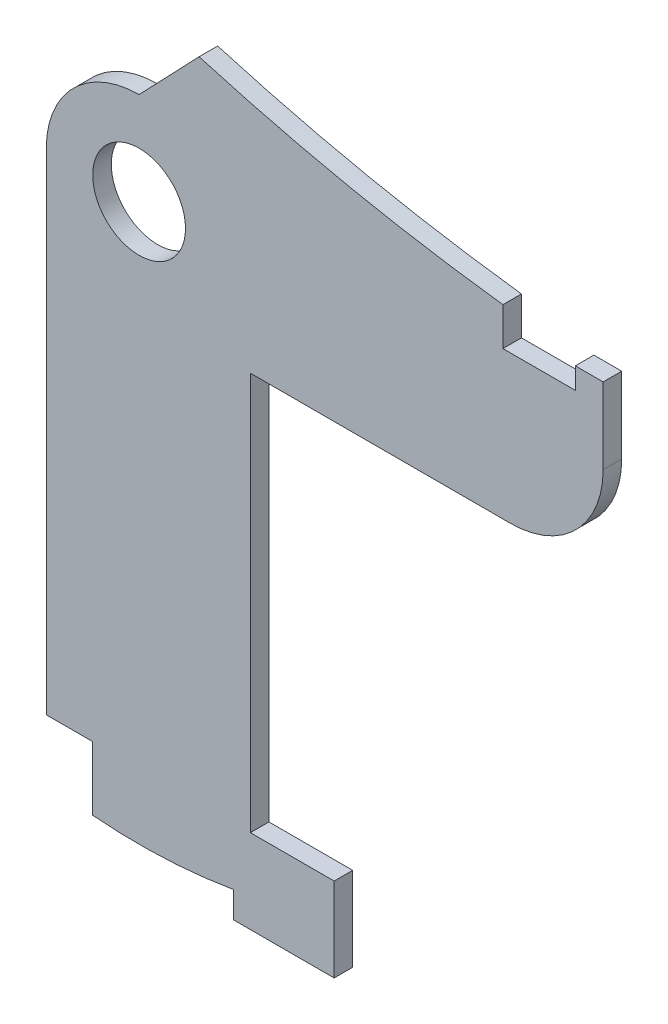
ISO-10303-21;
HEADER;
FILE_DESCRIPTION(('STEP AP214'),'2;1');
FILE_NAME('part.step','',(''),(''),'','','');
FILE_SCHEMA(('AUTOMOTIVE_DESIGN { 1 0 10303 214 1 1 1 1 }'));
ENDSEC;
DATA;
#1=APPLICATION_CONTEXT('core data for automotive mechanical design processes');
#2=APPLICATION_PROTOCOL_DEFINITION('international standard','automotive_design',2000,#1);
#3=PRODUCT_CONTEXT('',#1,'mechanical');
#4=PRODUCT('Part','Part','',(#3));
#5=PRODUCT_RELATED_PRODUCT_CATEGORY('part','',(#4));
#6=PRODUCT_DEFINITION_FORMATION('','',#4);
#7=PRODUCT_DEFINITION_CONTEXT('part definition',#1,'design');
#8=PRODUCT_DEFINITION('design','',#6,#7);
#9=PRODUCT_DEFINITION_SHAPE('','',#8);
#10=(LENGTH_UNIT() NAMED_UNIT(*) SI_UNIT(.MILLI.,.METRE.));
#11=(NAMED_UNIT(*) PLANE_ANGLE_UNIT() SI_UNIT($,.RADIAN.));
#12=(NAMED_UNIT(*) SI_UNIT($,.STERADIAN.) SOLID_ANGLE_UNIT());
#13=UNCERTAINTY_MEASURE_WITH_UNIT(LENGTH_MEASURE(1.E-05),#10,'distance_accuracy_value','');
#14=(GEOMETRIC_REPRESENTATION_CONTEXT(3) GLOBAL_UNCERTAINTY_ASSIGNED_CONTEXT((#13)) GLOBAL_UNIT_ASSIGNED_CONTEXT((#10,
#11,#12)) REPRESENTATION_CONTEXT('',''));
#15=CARTESIAN_POINT('',(0.,0.,0.));
#16=DIRECTION('',(0.,0.,1.));
#17=DIRECTION('',(1.,0.,0.));
#18=AXIS2_PLACEMENT_3D('',#15,#16,#17);
#19=CARTESIAN_POINT('',(37.6551533401373,-13.2873216735918,1.));
#20=DIRECTION('',(0.,0.,-1.));
#21=DIRECTION('',(-1.,0.,0.));
#22=AXIS2_PLACEMENT_3D('',#19,#20,#21);
#23=CYLINDRICAL_SURFACE('',#22,5.);
#24=CARTESIAN_POINT('',(37.6551533401373,-13.2873216735918,0.));
#25=DIRECTION('',(0.,0.,1.));
#26=DIRECTION('',(1.,0.,0.));
#27=AXIS2_PLACEMENT_3D('',#24,#25,#26);
#28=CIRCLE('',#27,5.);
#29=CARTESIAN_POINT('',(42.6551533401373,-13.2873216735918,0.));
#30=VERTEX_POINT('',#29);
#31=CARTESIAN_POINT('',(37.6551533401373,-18.2873216735918,0.));
#32=VERTEX_POINT('',#31);
#33=EDGE_CURVE('E198',#30,#32,#28,.F.);
#34=ORIENTED_EDGE('',*,*,#33,.F.);
#35=DIRECTION('',(0.,0.,-1.));
#36=VECTOR('',#35,1.);
#37=CARTESIAN_POINT('',(42.6551533401373,-13.2873216735918,1.));
#38=LINE('',#37,#36);
#39=CARTESIAN_POINT('',(42.6551533401373,-13.2873216735918,1.));
#40=VERTEX_POINT('',#39);
#41=EDGE_CURVE('E11',#40,#30,#38,.T.);
#42=ORIENTED_EDGE('',*,*,#41,.F.);
#43=CARTESIAN_POINT('',(37.6551533401373,-13.2873216735918,1.));
#44=DIRECTION('',(0.,0.,1.));
#45=DIRECTION('',(1.,0.,0.));
#46=AXIS2_PLACEMENT_3D('',#43,#44,#45);
#47=CIRCLE('',#46,5.);
#48=CARTESIAN_POINT('',(37.6551533401373,-18.2873216735918,1.));
#49=VERTEX_POINT('',#48);
#50=EDGE_CURVE('E250',#40,#49,#47,.F.);
#51=ORIENTED_EDGE('',*,*,#50,.T.);
#52=DIRECTION('',(0.,0.,-1.));
#53=VECTOR('',#52,1.);
#54=CARTESIAN_POINT('',(37.6551533401373,-18.2873216735918,1.));
#55=LINE('',#54,#53);
#56=EDGE_CURVE('E51',#49,#32,#55,.T.);
#57=ORIENTED_EDGE('',*,*,#56,.T.);
#58=EDGE_LOOP('',(#34,#42,#51,#57));
#59=FACE_BOUND('',#58,.T.);
#60=ADVANCED_FACE('F35',(#59),#23,.T.);
#61=CARTESIAN_POINT('',(42.6551533401373,0.,1.));
#62=DIRECTION('',(1.,0.,0.));
#63=DIRECTION('',(0.,0.,-1.));
#64=AXIS2_PLACEMENT_3D('',#61,#62,#63);
#65=PLANE('',#64);
#66=DIRECTION('',(0.,-1.,0.));
#67=VECTOR('',#66,1.);
#68=CARTESIAN_POINT('',(42.6551533401373,0.,0.));
#69=LINE('',#68,#67);
#70=CARTESIAN_POINT('',(42.6551533401373,-9.19140508374461,0.));
#71=VERTEX_POINT('',#70);
#72=EDGE_CURVE('E200',#71,#30,#69,.T.);
#73=ORIENTED_EDGE('',*,*,#72,.F.);
#74=DIRECTION('',(0.,0.,-1.));
#75=VECTOR('',#74,1.);
#76=CARTESIAN_POINT('',(42.6551533401373,-9.19140508374461,1.));
#77=LINE('',#76,#75);
#78=CARTESIAN_POINT('',(42.6551533401373,-9.19140508374461,1.));
#79=VERTEX_POINT('',#78);
#80=EDGE_CURVE('E43',#79,#71,#77,.T.);
#81=ORIENTED_EDGE('',*,*,#80,.F.);
#82=DIRECTION('',(0.,-1.,0.));
#83=VECTOR('',#82,1.);
#84=CARTESIAN_POINT('',(42.6551533401373,0.,1.));
#85=LINE('',#84,#83);
#86=EDGE_CURVE('E305',#79,#40,#85,.T.);
#87=ORIENTED_EDGE('',*,*,#86,.T.);
#88=ORIENTED_EDGE('',*,*,#41,.T.);
#89=EDGE_LOOP('',(#73,#81,#87,#88));
#90=FACE_BOUND('',#89,.T.);
#91=ADVANCED_FACE('F292',(#90),#65,.T.);
#92=CARTESIAN_POINT('',(0.,-9.19140508374461,1.));
#93=DIRECTION('',(0.,1.,0.));
#94=DIRECTION('',(0.,0.,1.));
#95=AXIS2_PLACEMENT_3D('',#92,#93,#94);
#96=PLANE('',#95);
#97=DIRECTION('',(1.,0.,0.));
#98=VECTOR('',#97,1.);
#99=CARTESIAN_POINT('',(0.,-9.19140508374461,0.));
#100=LINE('',#99,#98);
#101=CARTESIAN_POINT('',(41.1551533401373,-9.19140508374461,0.));
#102=VERTEX_POINT('',#101);
#103=EDGE_CURVE('E203',#102,#71,#100,.T.);
#104=ORIENTED_EDGE('',*,*,#103,.F.);
#105=DIRECTION('',(0.,0.,-1.));
#106=VECTOR('',#105,1.);
#107=CARTESIAN_POINT('',(41.1551533401373,-9.19140508374461,1.));
#108=LINE('',#107,#106);
#109=CARTESIAN_POINT('',(41.1551533401373,-9.19140508374461,1.));
#110=VERTEX_POINT('',#109);
#111=EDGE_CURVE('E281',#110,#102,#108,.T.);
#112=ORIENTED_EDGE('',*,*,#111,.F.);
#113=DIRECTION('',(1.,0.,0.));
#114=VECTOR('',#113,1.);
#115=CARTESIAN_POINT('',(0.,-9.19140508374461,1.));
#116=LINE('',#115,#114);
#117=EDGE_CURVE('E288',#110,#79,#116,.T.);
#118=ORIENTED_EDGE('',*,*,#117,.T.);
#119=ORIENTED_EDGE('',*,*,#80,.T.);
#120=EDGE_LOOP('',(#104,#112,#118,#119));
#121=FACE_BOUND('',#120,.T.);
#122=ADVANCED_FACE('F286',(#121),#96,.T.);
#123=CARTESIAN_POINT('',(41.1551533401373,0.,1.));
#124=DIRECTION('',(-1.,0.,0.));
#125=DIRECTION('',(0.,0.,1.));
#126=AXIS2_PLACEMENT_3D('',#123,#124,#125);
#127=PLANE('',#126);
#128=DIRECTION('',(0.,1.,0.));
#129=VECTOR('',#128,1.);
#130=CARTESIAN_POINT('',(41.1551533401373,0.,0.));
#131=LINE('',#130,#129);
#132=CARTESIAN_POINT('',(41.1551533401373,-10.3365932084194,0.));
#133=VERTEX_POINT('',#132);
#134=EDGE_CURVE('E206',#133,#102,#131,.T.);
#135=ORIENTED_EDGE('',*,*,#134,.F.);
#136=DIRECTION('',(0.,0.,-1.));
#137=VECTOR('',#136,1.);
#138=CARTESIAN_POINT('',(41.1551533401373,-10.3365932084194,1.));
#139=LINE('',#138,#137);
#140=CARTESIAN_POINT('',(41.1551533401373,-10.3365932084194,1.));
#141=VERTEX_POINT('',#140);
#142=EDGE_CURVE('E279',#141,#133,#139,.T.);
#143=ORIENTED_EDGE('',*,*,#142,.F.);
#144=DIRECTION('',(0.,1.,0.));
#145=VECTOR('',#144,1.);
#146=CARTESIAN_POINT('',(41.1551533401373,0.,1.));
#147=LINE('',#146,#145);
#148=EDGE_CURVE('E302',#141,#110,#147,.T.);
#149=ORIENTED_EDGE('',*,*,#148,.T.);
#150=ORIENTED_EDGE('',*,*,#111,.T.);
#151=EDGE_LOOP('',(#135,#143,#149,#150));
#152=FACE_BOUND('',#151,.T.);
#153=ADVANCED_FACE('F299',(#152),#127,.T.);
#154=CARTESIAN_POINT('',(0.,-10.3365932084194,1.));
#155=DIRECTION('',(0.,1.,0.));
#156=DIRECTION('',(0.,0.,1.));
#157=AXIS2_PLACEMENT_3D('',#154,#155,#156);
#158=PLANE('',#157);
#159=DIRECTION('',(1.,0.,0.));
#160=VECTOR('',#159,1.);
#161=CARTESIAN_POINT('',(0.,-10.3365932084194,0.));
#162=LINE('',#161,#160);
#163=CARTESIAN_POINT('',(37.2551533401373,-10.3365932084194,0.));
#164=VERTEX_POINT('',#163);
#165=EDGE_CURVE('E209',#164,#133,#162,.T.);
#166=ORIENTED_EDGE('',*,*,#165,.F.);
#167=DIRECTION('',(0.,0.,-1.));
#168=VECTOR('',#167,1.);
#169=CARTESIAN_POINT('',(37.2551533401373,-10.3365932084194,1.));
#170=LINE('',#169,#168);
#171=CARTESIAN_POINT('',(37.2551533401373,-10.3365932084194,1.));
#172=VERTEX_POINT('',#171);
#173=EDGE_CURVE('E277',#172,#164,#170,.T.);
#174=ORIENTED_EDGE('',*,*,#173,.F.);
#175=DIRECTION('',(1.,0.,0.));
#176=VECTOR('',#175,1.);
#177=CARTESIAN_POINT('',(0.,-10.3365932084194,1.));
#178=LINE('',#177,#176);
#179=EDGE_CURVE('E307',#172,#141,#178,.T.);
#180=ORIENTED_EDGE('',*,*,#179,.T.);
#181=ORIENTED_EDGE('',*,*,#142,.T.);
#182=EDGE_LOOP('',(#166,#174,#180,#181));
#183=FACE_BOUND('',#182,.T.);
#184=ADVANCED_FACE('F369',(#183),#158,.T.);
#185=CARTESIAN_POINT('',(37.2551533401373,0.,1.));
#186=DIRECTION('',(1.,0.,0.));
#187=DIRECTION('',(0.,0.,-1.));
#188=AXIS2_PLACEMENT_3D('',#185,#186,#187);
#189=PLANE('',#188);
#190=DIRECTION('',(0.,-1.,0.));
#191=VECTOR('',#190,1.);
#192=CARTESIAN_POINT('',(37.2551533401373,0.,0.));
#193=LINE('',#192,#191);
#194=CARTESIAN_POINT('',(37.2551533401373,-8.2873216735918,0.));
#195=VERTEX_POINT('',#194);
#196=EDGE_CURVE('E212',#195,#164,#193,.T.);
#197=ORIENTED_EDGE('',*,*,#196,.F.);
#198=DIRECTION('',(0.,0.,-1.));
#199=VECTOR('',#198,1.);
#200=CARTESIAN_POINT('',(37.2551533401373,-8.2873216735918,1.));
#201=LINE('',#200,#199);
#202=CARTESIAN_POINT('',(37.2551533401373,-8.2873216735918,1.));
#203=VERTEX_POINT('',#202);
#204=EDGE_CURVE('E275',#203,#195,#201,.T.);
#205=ORIENTED_EDGE('',*,*,#204,.F.);
#206=DIRECTION('',(0.,-1.,0.));
#207=VECTOR('',#206,1.);
#208=CARTESIAN_POINT('',(37.2551533401373,0.,1.));
#209=LINE('',#208,#207);
#210=EDGE_CURVE('E313',#203,#172,#209,.T.);
#211=ORIENTED_EDGE('',*,*,#210,.T.);
#212=ORIENTED_EDGE('',*,*,#173,.T.);
#213=EDGE_LOOP('',(#197,#205,#211,#212));
#214=FACE_BOUND('',#213,.T.);
#215=ADVANCED_FACE('F372',(#214),#189,.T.);
#216=CARTESIAN_POINT('',(49.9016252193587,94.1810195769606,1.));
#217=DIRECTION('',(0.,0.,-1.));
#218=DIRECTION('',(-1.,0.,0.));
#219=AXIS2_PLACEMENT_3D('',#216,#217,#218);
#220=CYLINDRICAL_SURFACE('',#219,103.245795118405);
#221=CARTESIAN_POINT('',(49.9016252193587,94.1810195769606,0.));
#222=DIRECTION('',(0.,0.,1.));
#223=DIRECTION('',(1.,0.,0.));
#224=AXIS2_PLACEMENT_3D('',#221,#222,#223);
#225=CIRCLE('',#224,103.245795118405);
#226=CARTESIAN_POINT('',(20.8870655256356,-4.90404254347698,0.));
#227=VERTEX_POINT('',#226);
#228=EDGE_CURVE('E215',#195,#227,#225,.F.);
#229=ORIENTED_EDGE('',*,*,#228,.T.);
#230=DIRECTION('',(0.,0.,-1.));
#231=VECTOR('',#230,1.);
#232=CARTESIAN_POINT('',(20.8870655256356,-4.90404254347698,1.));
#233=LINE('',#232,#231);
#234=CARTESIAN_POINT('',(20.8870655256356,-4.90404254347698,1.));
#235=VERTEX_POINT('',#234);
#236=EDGE_CURVE('E273',#235,#227,#233,.T.);
#237=ORIENTED_EDGE('',*,*,#236,.F.);
#238=CARTESIAN_POINT('',(49.9016252193587,94.1810195769606,1.));
#239=DIRECTION('',(0.,0.,1.));
#240=DIRECTION('',(1.,0.,0.));
#241=AXIS2_PLACEMENT_3D('',#238,#239,#240);
#242=CIRCLE('',#241,103.245795118405);
#243=EDGE_CURVE('E316',#203,#235,#242,.F.);
#244=ORIENTED_EDGE('',*,*,#243,.F.);
#245=ORIENTED_EDGE('',*,*,#204,.T.);
#246=EDGE_LOOP('',(#229,#237,#244,#245));
#247=FACE_BOUND('',#246,.T.);
#248=ADVANCED_FACE('F376',(#247),#220,.F.);
#249=CARTESIAN_POINT('',(13.3706696032515,-12.772469653591,1.));
#250=DIRECTION('',(-0.723097327047915,0.690746158596746,0.));
#251=DIRECTION('',(-0.690746158596746,-0.723097327047915,0.));
#252=AXIS2_PLACEMENT_3D('',#249,#250,#251);
#253=PLANE('',#252);
#254=DIRECTION('',(0.690746158596746,0.723097327047915,0.));
#255=VECTOR('',#254,1.);
#256=CARTESIAN_POINT('',(13.3706696032515,-12.772469653591,0.));
#257=LINE('',#256,#255);
#258=CARTESIAN_POINT('',(17.6551533401373,-8.2873216735918,0.));
#259=VERTEX_POINT('',#258);
#260=EDGE_CURVE('E218',#259,#227,#257,.T.);
#261=ORIENTED_EDGE('',*,*,#260,.F.);
#262=DIRECTION('',(0.,0.,-1.));
#263=VECTOR('',#262,1.);
#264=CARTESIAN_POINT('',(17.6551533401373,-8.2873216735918,1.));
#265=LINE('',#264,#263);
#266=CARTESIAN_POINT('',(17.6551533401373,-8.2873216735918,1.));
#267=VERTEX_POINT('',#266);
#268=EDGE_CURVE('E271',#267,#259,#265,.T.);
#269=ORIENTED_EDGE('',*,*,#268,.F.);
#270=DIRECTION('',(0.690746158596746,0.723097327047915,0.));
#271=VECTOR('',#270,1.);
#272=CARTESIAN_POINT('',(13.3706696032515,-12.772469653591,1.));
#273=LINE('',#272,#271);
#274=EDGE_CURVE('E318',#267,#235,#273,.T.);
#275=ORIENTED_EDGE('',*,*,#274,.T.);
#276=ORIENTED_EDGE('',*,*,#236,.T.);
#277=EDGE_LOOP('',(#261,#269,#275,#276));
#278=FACE_BOUND('',#277,.T.);
#279=ADVANCED_FACE('F380',(#278),#253,.T.);
#280=CARTESIAN_POINT('',(17.6551533401373,-13.2873216735918,1.));
#281=DIRECTION('',(0.,0.,-1.));
#282=DIRECTION('',(-1.,0.,0.));
#283=AXIS2_PLACEMENT_3D('',#280,#281,#282);
#284=CYLINDRICAL_SURFACE('',#283,5.);
#285=CARTESIAN_POINT('',(17.6551533401373,-13.2873216735918,0.));
#286=DIRECTION('',(0.,0.,1.));
#287=DIRECTION('',(1.,0.,0.));
#288=AXIS2_PLACEMENT_3D('',#285,#286,#287);
#289=CIRCLE('',#288,5.);
#290=CARTESIAN_POINT('',(12.6551533401373,-13.2873216735918,0.));
#291=VERTEX_POINT('',#290);
#292=EDGE_CURVE('E221',#259,#291,#289,.T.);
#293=ORIENTED_EDGE('',*,*,#292,.T.);
#294=DIRECTION('',(0.,0.,-1.));
#295=VECTOR('',#294,1.);
#296=CARTESIAN_POINT('',(12.6551533401373,-13.2873216735918,1.));
#297=LINE('',#296,#295);
#298=CARTESIAN_POINT('',(12.6551533401373,-13.2873216735918,1.));
#299=VERTEX_POINT('',#298);
#300=EDGE_CURVE('E269',#299,#291,#297,.T.);
#301=ORIENTED_EDGE('',*,*,#300,.F.);
#302=CARTESIAN_POINT('',(17.6551533401373,-13.2873216735918,1.));
#303=DIRECTION('',(0.,0.,1.));
#304=DIRECTION('',(1.,0.,0.));
#305=AXIS2_PLACEMENT_3D('',#302,#303,#304);
#306=CIRCLE('',#305,5.);
#307=EDGE_CURVE('E321',#267,#299,#306,.T.);
#308=ORIENTED_EDGE('',*,*,#307,.F.);
#309=ORIENTED_EDGE('',*,*,#268,.T.);
#310=EDGE_LOOP('',(#293,#301,#308,#309));
#311=FACE_BOUND('',#310,.T.);
#312=ADVANCED_FACE('F384',(#311),#284,.T.);
#313=CARTESIAN_POINT('',(12.6551533401373,0.,1.));
#314=DIRECTION('',(-1.,0.,0.));
#315=DIRECTION('',(0.,-1.,0.));
#316=AXIS2_PLACEMENT_3D('',#313,#314,#315);
#317=PLANE('',#316);
#318=DIRECTION('',(0.,1.,0.));
#319=VECTOR('',#318,1.);
#320=CARTESIAN_POINT('',(12.6551533401373,0.,0.));
#321=LINE('',#320,#319);
#322=CARTESIAN_POINT('',(12.6551533401373,-39.7249994987501,0.));
#323=VERTEX_POINT('',#322);
#324=EDGE_CURVE('E224',#323,#291,#321,.T.);
#325=ORIENTED_EDGE('',*,*,#324,.F.);
#326=DIRECTION('',(0.,0.,-1.));
#327=VECTOR('',#326,1.);
#328=CARTESIAN_POINT('',(12.6551533401373,-39.7249994987501,1.));
#329=LINE('',#328,#327);
#330=CARTESIAN_POINT('',(12.6551533401373,-39.7249994987501,1.));
#331=VERTEX_POINT('',#330);
#332=EDGE_CURVE('E267',#331,#323,#329,.T.);
#333=ORIENTED_EDGE('',*,*,#332,.F.);
#334=DIRECTION('',(0.,1.,0.));
#335=VECTOR('',#334,1.);
#336=CARTESIAN_POINT('',(12.6551533401373,0.,1.));
#337=LINE('',#336,#335);
#338=EDGE_CURVE('E323',#331,#299,#337,.T.);
#339=ORIENTED_EDGE('',*,*,#338,.T.);
#340=ORIENTED_EDGE('',*,*,#300,.T.);
#341=EDGE_LOOP('',(#325,#333,#339,#340));
#342=FACE_BOUND('',#341,.T.);
#343=ADVANCED_FACE('F388',(#342),#317,.T.);
#344=CARTESIAN_POINT('',(0.,-39.7249994987501,1.));
#345=DIRECTION('',(0.,-1.,0.));
#346=DIRECTION('',(0.,0.,-1.));
#347=AXIS2_PLACEMENT_3D('',#344,#345,#346);
#348=PLANE('',#347);
#349=DIRECTION('',(-1.,0.,0.));
#350=VECTOR('',#349,1.);
#351=CARTESIAN_POINT('',(0.,-39.7249994987501,0.));
#352=LINE('',#351,#350);
#353=CARTESIAN_POINT('',(15.1551533401373,-39.7249994987501,0.));
#354=VERTEX_POINT('',#353);
#355=EDGE_CURVE('E227',#354,#323,#352,.T.);
#356=ORIENTED_EDGE('',*,*,#355,.F.);
#357=DIRECTION('',(0.,0.,-1.));
#358=VECTOR('',#357,1.);
#359=CARTESIAN_POINT('',(15.1551533401373,-39.7249994987501,1.));
#360=LINE('',#359,#358);
#361=CARTESIAN_POINT('',(15.1551533401373,-39.7249994987501,1.));
#362=VERTEX_POINT('',#361);
#363=EDGE_CURVE('E265',#362,#354,#360,.T.);
#364=ORIENTED_EDGE('',*,*,#363,.F.);
#365=DIRECTION('',(-1.,0.,0.));
#366=VECTOR('',#365,1.);
#367=CARTESIAN_POINT('',(0.,-39.7249994987501,1.));
#368=LINE('',#367,#366);
#369=EDGE_CURVE('E326',#362,#331,#368,.T.);
#370=ORIENTED_EDGE('',*,*,#369,.T.);
#371=ORIENTED_EDGE('',*,*,#332,.T.);
#372=EDGE_LOOP('',(#356,#364,#370,#371));
#373=FACE_BOUND('',#372,.T.);
#374=ADVANCED_FACE('F392',(#373),#348,.T.);
#375=CARTESIAN_POINT('',(15.1551533401373,0.,1.));
#376=DIRECTION('',(-1.,0.,0.));
#377=DIRECTION('',(0.,0.,1.));
#378=AXIS2_PLACEMENT_3D('',#375,#376,#377);
#379=PLANE('',#378);
#380=DIRECTION('',(0.,1.,0.));
#381=VECTOR('',#380,1.);
#382=CARTESIAN_POINT('',(15.1551533401373,0.,0.));
#383=LINE('',#382,#381);
#384=CARTESIAN_POINT('',(15.1551533401373,-43.1617960065011,0.));
#385=VERTEX_POINT('',#384);
#386=EDGE_CURVE('E230',#385,#354,#383,.T.);
#387=ORIENTED_EDGE('',*,*,#386,.F.);
#388=DIRECTION('',(0.,0.,-1.));
#389=VECTOR('',#388,1.);
#390=CARTESIAN_POINT('',(15.1551533401373,-43.1617960065011,1.));
#391=LINE('',#390,#389);
#392=CARTESIAN_POINT('',(15.1551533401373,-43.1617960065011,1.));
#393=VERTEX_POINT('',#392);
#394=EDGE_CURVE('E263',#393,#385,#391,.T.);
#395=ORIENTED_EDGE('',*,*,#394,.F.);
#396=DIRECTION('',(0.,1.,0.));
#397=VECTOR('',#396,1.);
#398=CARTESIAN_POINT('',(15.1551533401373,0.,1.));
#399=LINE('',#398,#397);
#400=EDGE_CURVE('E329',#393,#362,#399,.T.);
#401=ORIENTED_EDGE('',*,*,#400,.T.);
#402=ORIENTED_EDGE('',*,*,#363,.T.);
#403=EDGE_LOOP('',(#387,#395,#401,#402));
#404=FACE_BOUND('',#403,.T.);
#405=ADVANCED_FACE('F396',(#404),#379,.T.);
#406=CARTESIAN_POINT('',(17.6551533401373,-13.2873216735918,1.));
#407=DIRECTION('',(0.,0.,-1.));
#408=DIRECTION('',(-1.,0.,0.));
#409=AXIS2_PLACEMENT_3D('',#406,#407,#408);
#410=CYLINDRICAL_SURFACE('',#409,29.9788961882798);
#411=CARTESIAN_POINT('',(17.6551533401373,-13.2873216735918,0.));
#412=DIRECTION('',(0.,0.,1.));
#413=DIRECTION('',(1.,0.,0.));
#414=AXIS2_PLACEMENT_3D('',#411,#412,#413);
#415=CIRCLE('',#414,29.9788961882798);
#416=CARTESIAN_POINT('',(22.731294665656,-42.8333367333425,0.));
#417=VERTEX_POINT('',#416);
#418=EDGE_CURVE('E233',#385,#417,#415,.T.);
#419=ORIENTED_EDGE('',*,*,#418,.T.);
#420=DIRECTION('',(0.,0.,-1.));
#421=VECTOR('',#420,1.);
#422=CARTESIAN_POINT('',(22.731294665656,-42.8333367333425,1.));
#423=LINE('',#422,#421);
#424=CARTESIAN_POINT('',(22.731294665656,-42.8333367333425,1.));
#425=VERTEX_POINT('',#424);
#426=EDGE_CURVE('E260',#425,#417,#423,.T.);
#427=ORIENTED_EDGE('',*,*,#426,.F.);
#428=CARTESIAN_POINT('',(17.6551533401373,-13.2873216735918,1.));
#429=DIRECTION('',(0.,0.,1.));
#430=DIRECTION('',(1.,0.,0.));
#431=AXIS2_PLACEMENT_3D('',#428,#429,#430);
#432=CIRCLE('',#431,29.9788961882798);
#433=EDGE_CURVE('E332',#393,#425,#432,.T.);
#434=ORIENTED_EDGE('',*,*,#433,.F.);
#435=ORIENTED_EDGE('',*,*,#394,.T.);
#436=EDGE_LOOP('',(#419,#427,#434,#435));
#437=FACE_BOUND('',#436,.T.);
#438=ADVANCED_FACE('F400',(#437),#410,.T.);
#439=CARTESIAN_POINT('',(22.731294665656,0.,1.));
#440=DIRECTION('',(1.,0.,0.));
#441=DIRECTION('',(0.,0.,-1.));
#442=AXIS2_PLACEMENT_3D('',#439,#440,#441);
#443=PLANE('',#442);
#444=DIRECTION('',(0.,-1.,0.));
#445=VECTOR('',#444,1.);
#446=CARTESIAN_POINT('',(22.731294665656,0.,0.));
#447=LINE('',#446,#445);
#448=CARTESIAN_POINT('',(22.731294665656,-44.2490790535218,0.));
#449=VERTEX_POINT('',#448);
#450=EDGE_CURVE('E235',#417,#449,#447,.T.);
#451=ORIENTED_EDGE('',*,*,#450,.T.);
#452=DIRECTION('',(0.,0.,-1.));
#453=VECTOR('',#452,1.);
#454=CARTESIAN_POINT('',(22.731294665656,-44.2490790535218,1.));
#455=LINE('',#454,#453);
#456=CARTESIAN_POINT('',(22.731294665656,-44.2490790535218,1.));
#457=VERTEX_POINT('',#456);
#458=EDGE_CURVE('E257',#457,#449,#455,.T.);
#459=ORIENTED_EDGE('',*,*,#458,.F.);
#460=DIRECTION('',(0.,-1.,0.));
#461=VECTOR('',#460,1.);
#462=CARTESIAN_POINT('',(22.731294665656,0.,1.));
#463=LINE('',#462,#461);
#464=EDGE_CURVE('E334',#425,#457,#463,.T.);
#465=ORIENTED_EDGE('',*,*,#464,.F.);
#466=ORIENTED_EDGE('',*,*,#426,.T.);
#467=EDGE_LOOP('',(#451,#459,#465,#466));
#468=FACE_BOUND('',#467,.T.);
#469=ADVANCED_FACE('F404',(#468),#443,.F.);
#470=CARTESIAN_POINT('',(0.,-44.2490790535218,1.));
#471=DIRECTION('',(0.,1.,0.));
#472=DIRECTION('',(0.,0.,1.));
#473=AXIS2_PLACEMENT_3D('',#470,#471,#472);
#474=PLANE('',#473);
#475=DIRECTION('',(1.,0.,0.));
#476=VECTOR('',#475,1.);
#477=CARTESIAN_POINT('',(0.,-44.2490790535218,0.));
#478=LINE('',#477,#476);
#479=CARTESIAN_POINT('',(28.1634057429237,-44.2490790535218,0.));
#480=VERTEX_POINT('',#479);
#481=EDGE_CURVE('E237',#449,#480,#478,.T.);
#482=ORIENTED_EDGE('',*,*,#481,.T.);
#483=DIRECTION('',(0.,0.,-1.));
#484=VECTOR('',#483,1.);
#485=CARTESIAN_POINT('',(28.1634057429237,-44.2490790535218,1.));
#486=LINE('',#485,#484);
#487=CARTESIAN_POINT('',(28.1634057429237,-44.2490790535218,1.));
#488=VERTEX_POINT('',#487);
#489=EDGE_CURVE('E254',#488,#480,#486,.T.);
#490=ORIENTED_EDGE('',*,*,#489,.F.);
#491=DIRECTION('',(1.,0.,0.));
#492=VECTOR('',#491,1.);
#493=CARTESIAN_POINT('',(0.,-44.2490790535218,1.));
#494=LINE('',#493,#492);
#495=EDGE_CURVE('E336',#457,#488,#494,.T.);
#496=ORIENTED_EDGE('',*,*,#495,.F.);
#497=ORIENTED_EDGE('',*,*,#458,.T.);
#498=EDGE_LOOP('',(#482,#490,#496,#497));
#499=FACE_BOUND('',#498,.T.);
#500=ADVANCED_FACE('F342',(#499),#474,.F.);
#501=CARTESIAN_POINT('',(28.1634057429237,0.,1.));
#502=DIRECTION('',(-1.,0.,0.));
#503=DIRECTION('',(0.,0.,1.));
#504=AXIS2_PLACEMENT_3D('',#501,#502,#503);
#505=PLANE('',#504);
#506=DIRECTION('',(0.,1.,0.));
#507=VECTOR('',#506,1.);
#508=CARTESIAN_POINT('',(28.1634057429237,0.,0.));
#509=LINE('',#508,#507);
#510=CARTESIAN_POINT('',(28.1634057429237,-39.7249994987501,0.));
#511=VERTEX_POINT('',#510);
#512=EDGE_CURVE('E239',#480,#511,#509,.T.);
#513=ORIENTED_EDGE('',*,*,#512,.T.);
#514=DIRECTION('',(0.,0.,-1.));
#515=VECTOR('',#514,1.);
#516=CARTESIAN_POINT('',(28.1634057429237,-39.7249994987501,1.));
#517=LINE('',#516,#515);
#518=CARTESIAN_POINT('',(28.1634057429237,-39.7249994987501,1.));
#519=VERTEX_POINT('',#518);
#520=EDGE_CURVE('E187',#519,#511,#517,.T.);
#521=ORIENTED_EDGE('',*,*,#520,.F.);
#522=DIRECTION('',(0.,1.,0.));
#523=VECTOR('',#522,1.);
#524=CARTESIAN_POINT('',(28.1634057429237,0.,1.));
#525=LINE('',#524,#523);
#526=EDGE_CURVE('E175',#488,#519,#525,.T.);
#527=ORIENTED_EDGE('',*,*,#526,.F.);
#528=ORIENTED_EDGE('',*,*,#489,.T.);
#529=EDGE_LOOP('',(#513,#521,#527,#528));
#530=FACE_BOUND('',#529,.T.);
#531=ADVANCED_FACE('F346',(#530),#505,.F.);
#532=CARTESIAN_POINT('',(0.,-39.7249994987501,1.));
#533=DIRECTION('',(0.,-1.,0.));
#534=DIRECTION('',(0.,0.,-1.));
#535=AXIS2_PLACEMENT_3D('',#532,#533,#534);
#536=PLANE('',#535);
#537=DIRECTION('',(-1.,0.,0.));
#538=VECTOR('',#537,1.);
#539=CARTESIAN_POINT('',(0.,-39.7249994987501,0.));
#540=LINE('',#539,#538);
#541=CARTESIAN_POINT('',(23.6500222638875,-39.7249994987501,0.));
#542=VERTEX_POINT('',#541);
#543=EDGE_CURVE('E184',#511,#542,#540,.T.);
#544=ORIENTED_EDGE('',*,*,#543,.T.);
#545=DIRECTION('',(0.,0.,-1.));
#546=VECTOR('',#545,1.);
#547=CARTESIAN_POINT('',(23.6500222638875,-39.7249994987501,1.));
#548=LINE('',#547,#546);
#549=CARTESIAN_POINT('',(23.6500222638875,-39.7249994987501,1.));
#550=VERTEX_POINT('',#549);
#551=EDGE_CURVE('E181',#550,#542,#548,.T.);
#552=ORIENTED_EDGE('',*,*,#551,.F.);
#553=DIRECTION('',(-1.,0.,0.));
#554=VECTOR('',#553,1.);
#555=CARTESIAN_POINT('',(0.,-39.7249994987501,1.));
#556=LINE('',#555,#554);
#557=EDGE_CURVE('E167',#519,#550,#556,.T.);
#558=ORIENTED_EDGE('',*,*,#557,.F.);
#559=ORIENTED_EDGE('',*,*,#520,.T.);
#560=EDGE_LOOP('',(#544,#552,#558,#559));
#561=FACE_BOUND('',#560,.T.);
#562=ADVANCED_FACE('F182',(#561),#536,.F.);
#563=CARTESIAN_POINT('',(23.6500222638874,0.,1.));
#564=DIRECTION('',(1.,0.,0.));
#565=DIRECTION('',(0.,1.,0.));
#566=AXIS2_PLACEMENT_3D('',#563,#564,#565);
#567=PLANE('',#566);
#568=DIRECTION('',(0.,-1.,0.));
#569=VECTOR('',#568,1.);
#570=CARTESIAN_POINT('',(23.6500222638874,0.,0.));
#571=LINE('',#570,#569);
#572=CARTESIAN_POINT('',(23.6500222638875,-18.2873216735918,0.));
#573=VERTEX_POINT('',#572);
#574=EDGE_CURVE('E242',#573,#542,#571,.T.);
#575=ORIENTED_EDGE('',*,*,#574,.F.);
#576=DIRECTION('',(0.,0.,-1.));
#577=VECTOR('',#576,1.);
#578=CARTESIAN_POINT('',(23.6500222638875,-18.2873216735918,1.));
#579=LINE('',#578,#577);
#580=CARTESIAN_POINT('',(23.6500222638875,-18.2873216735918,1.));
#581=VERTEX_POINT('',#580);
#582=EDGE_CURVE('E109',#581,#573,#579,.T.);
#583=ORIENTED_EDGE('',*,*,#582,.F.);
#584=DIRECTION('',(0.,-1.,0.));
#585=VECTOR('',#584,1.);
#586=CARTESIAN_POINT('',(23.6500222638874,0.,1.));
#587=LINE('',#586,#585);
#588=EDGE_CURVE('E173',#581,#550,#587,.T.);
#589=ORIENTED_EDGE('',*,*,#588,.T.);
#590=ORIENTED_EDGE('',*,*,#551,.T.);
#591=EDGE_LOOP('',(#575,#583,#589,#590));
#592=FACE_BOUND('',#591,.T.);
#593=ADVANCED_FACE('F189',(#592),#567,.T.);
#594=CARTESIAN_POINT('',(0.,-18.2873216735918,1.));
#595=DIRECTION('',(0.,-1.,0.));
#596=DIRECTION('',(0.,0.,-1.));
#597=AXIS2_PLACEMENT_3D('',#594,#595,#596);
#598=PLANE('',#597);
#599=DIRECTION('',(-1.,0.,0.));
#600=VECTOR('',#599,1.);
#601=CARTESIAN_POINT('',(0.,-18.2873216735918,0.));
#602=LINE('',#601,#600);
#603=EDGE_CURVE('E244',#32,#573,#602,.T.);
#604=ORIENTED_EDGE('',*,*,#603,.F.);
#605=ORIENTED_EDGE('',*,*,#56,.F.);
#606=DIRECTION('',(-1.,0.,0.));
#607=VECTOR('',#606,1.);
#608=CARTESIAN_POINT('',(0.,-18.2873216735918,1.));
#609=LINE('',#608,#607);
#610=EDGE_CURVE('E190',#49,#581,#609,.T.);
#611=ORIENTED_EDGE('',*,*,#610,.T.);
#612=ORIENTED_EDGE('',*,*,#582,.T.);
#613=EDGE_LOOP('',(#604,#605,#611,#612));
#614=FACE_BOUND('',#613,.T.);
#615=ADVANCED_FACE('F347',(#614),#598,.T.);
#616=CARTESIAN_POINT('',(17.6551533401373,-13.2873216735918,1.));
#617=DIRECTION('',(0.,0.,-1.));
#618=DIRECTION('',(-1.,0.,0.));
#619=AXIS2_PLACEMENT_3D('',#616,#617,#618);
#620=CYLINDRICAL_SURFACE('',#619,2.5);
#621=CARTESIAN_POINT('',(17.6551533401373,-13.2873216735918,1.));
#622=DIRECTION('',(0.,0.,1.));
#623=DIRECTION('',(1.,0.,0.));
#624=AXIS2_PLACEMENT_3D('',#621,#622,#623);
#625=CIRCLE('',#624,2.5);
#626=CARTESIAN_POINT('',(20.1551533401373,-13.2873216735918,1.));
#627=VERTEX_POINT('',#626);
#628=EDGE_CURVE('E192',#627,#627,#625,.T.);
#629=ORIENTED_EDGE('',*,*,#628,.T.);
#630=EDGE_LOOP('',(#629));
#631=FACE_BOUND('',#630,.T.);
#632=CARTESIAN_POINT('',(17.6551533401373,-13.2873216735918,0.));
#633=DIRECTION('',(0.,0.,1.));
#634=DIRECTION('',(1.,0.,0.));
#635=AXIS2_PLACEMENT_3D('',#632,#633,#634);
#636=CIRCLE('',#635,2.5);
#637=CARTESIAN_POINT('',(20.1551533401373,-13.2873216735918,0.));
#638=VERTEX_POINT('',#637);
#639=EDGE_CURVE('E247',#638,#638,#636,.T.);
#640=ORIENTED_EDGE('',*,*,#639,.F.);
#641=EDGE_LOOP('',(#640));
#642=FACE_BOUND('',#641,.T.);
#643=ADVANCED_FACE('F349',(#631,#642),#620,.F.);
#644=CARTESIAN_POINT('',(0.,0.,1.));
#645=DIRECTION('',(0.,0.,1.));
#646=DIRECTION('',(1.,0.,0.));
#647=AXIS2_PLACEMENT_3D('',#644,#645,#646);
#648=PLANE('',#647);
#649=ORIENTED_EDGE('',*,*,#50,.F.);
#650=ORIENTED_EDGE('',*,*,#86,.F.);
#651=ORIENTED_EDGE('',*,*,#117,.F.);
#652=ORIENTED_EDGE('',*,*,#148,.F.);
#653=ORIENTED_EDGE('',*,*,#179,.F.);
#654=ORIENTED_EDGE('',*,*,#210,.F.);
#655=ORIENTED_EDGE('',*,*,#243,.T.);
#656=ORIENTED_EDGE('',*,*,#274,.F.);
#657=ORIENTED_EDGE('',*,*,#307,.T.);
#658=ORIENTED_EDGE('',*,*,#338,.F.);
#659=ORIENTED_EDGE('',*,*,#369,.F.);
#660=ORIENTED_EDGE('',*,*,#400,.F.);
#661=ORIENTED_EDGE('',*,*,#433,.T.);
#662=ORIENTED_EDGE('',*,*,#464,.T.);
#663=ORIENTED_EDGE('',*,*,#495,.T.);
#664=ORIENTED_EDGE('',*,*,#526,.T.);
#665=ORIENTED_EDGE('',*,*,#557,.T.);
#666=ORIENTED_EDGE('',*,*,#588,.F.);
#667=ORIENTED_EDGE('',*,*,#610,.F.);
#668=EDGE_LOOP('',(#649,#650,#651,#652,#653,#654,#655,#656,#657,#658,#659,#660,#661,#662,#663,
#664,#665,#666,#667));
#669=FACE_BOUND('',#668,.T.);
#670=ORIENTED_EDGE('',*,*,#628,.F.);
#671=EDGE_LOOP('',(#670));
#672=FACE_BOUND('',#671,.T.);
#673=ADVANCED_FACE('F169',(#669,#672),#648,.T.);
#674=CARTESIAN_POINT('',(0.,0.,0.));
#675=DIRECTION('',(0.,0.,1.));
#676=DIRECTION('',(1.,0.,0.));
#677=AXIS2_PLACEMENT_3D('',#674,#675,#676);
#678=PLANE('',#677);
#679=ORIENTED_EDGE('',*,*,#33,.T.);
#680=ORIENTED_EDGE('',*,*,#603,.T.);
#681=ORIENTED_EDGE('',*,*,#574,.T.);
#682=ORIENTED_EDGE('',*,*,#543,.F.);
#683=ORIENTED_EDGE('',*,*,#512,.F.);
#684=ORIENTED_EDGE('',*,*,#481,.F.);
#685=ORIENTED_EDGE('',*,*,#450,.F.);
#686=ORIENTED_EDGE('',*,*,#418,.F.);
#687=ORIENTED_EDGE('',*,*,#386,.T.);
#688=ORIENTED_EDGE('',*,*,#355,.T.);
#689=ORIENTED_EDGE('',*,*,#324,.T.);
#690=ORIENTED_EDGE('',*,*,#292,.F.);
#691=ORIENTED_EDGE('',*,*,#260,.T.);
#692=ORIENTED_EDGE('',*,*,#228,.F.);
#693=ORIENTED_EDGE('',*,*,#196,.T.);
#694=ORIENTED_EDGE('',*,*,#165,.T.);
#695=ORIENTED_EDGE('',*,*,#134,.T.);
#696=ORIENTED_EDGE('',*,*,#103,.T.);
#697=ORIENTED_EDGE('',*,*,#72,.T.);
#698=EDGE_LOOP('',(#679,#680,#681,#682,#683,#684,#685,#686,#687,#688,#689,#690,#691,#692,#693,
#694,#695,#696,#697));
#699=FACE_BOUND('',#698,.T.);
#700=ORIENTED_EDGE('',*,*,#639,.T.);
#701=EDGE_LOOP('',(#700));
#702=FACE_BOUND('',#701,.T.);
#703=ADVANCED_FACE('F294',(#699,#702),#678,.F.);
#704=CLOSED_SHELL('',(#60,#91,#122,#153,#184,#215,#248,#279,#312,#343,#374,#405,#438,#469,#500,
#531,#562,#593,#615,#643,#673,#703));
#705=MANIFOLD_SOLID_BREP('B2',#704);
#706=ADVANCED_BREP_SHAPE_REPRESENTATION('',(#18,#705),#14);
#707=SHAPE_DEFINITION_REPRESENTATION(#9,#706);
ENDSEC;
END-ISO-10303-21;
